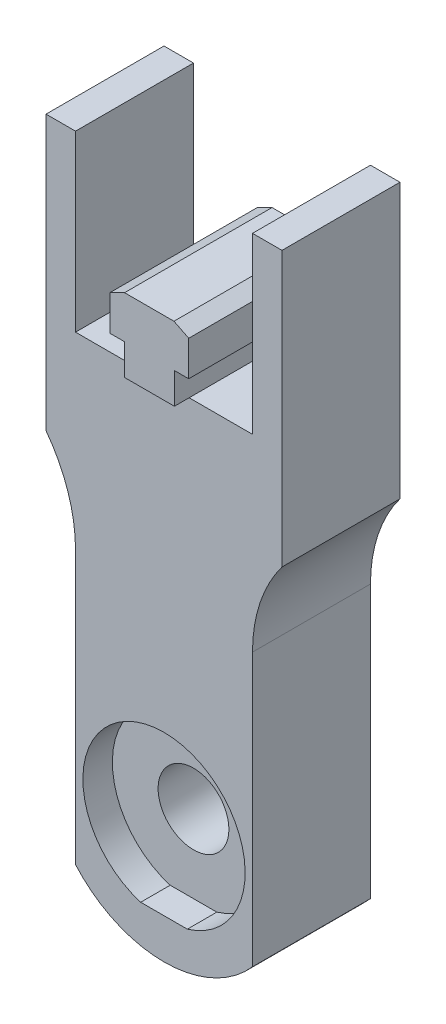
ISO-10303-21;
HEADER;
FILE_DESCRIPTION(('STEP AP214'),'2;1');
FILE_NAME('part.step','',(''),(''),'','','');
FILE_SCHEMA(('AUTOMOTIVE_DESIGN { 1 0 10303 214 1 1 1 1 }'));
ENDSEC;
DATA;
#1=APPLICATION_CONTEXT('core data for automotive mechanical design processes');
#2=APPLICATION_PROTOCOL_DEFINITION('international standard','automotive_design',2000,#1);
#3=PRODUCT_CONTEXT('',#1,'mechanical');
#4=PRODUCT('Part','Part','',(#3));
#5=PRODUCT_RELATED_PRODUCT_CATEGORY('part','',(#4));
#6=PRODUCT_DEFINITION_FORMATION('','',#4);
#7=PRODUCT_DEFINITION_CONTEXT('part definition',#1,'design');
#8=PRODUCT_DEFINITION('design','',#6,#7);
#9=PRODUCT_DEFINITION_SHAPE('','',#8);
#10=(LENGTH_UNIT() NAMED_UNIT(*) SI_UNIT(.MILLI.,.METRE.));
#11=(NAMED_UNIT(*) PLANE_ANGLE_UNIT() SI_UNIT($,.RADIAN.));
#12=(NAMED_UNIT(*) SI_UNIT($,.STERADIAN.) SOLID_ANGLE_UNIT());
#13=UNCERTAINTY_MEASURE_WITH_UNIT(LENGTH_MEASURE(1.E-05),#10,'distance_accuracy_value','');
#14=(GEOMETRIC_REPRESENTATION_CONTEXT(3) GLOBAL_UNCERTAINTY_ASSIGNED_CONTEXT((#13)) GLOBAL_UNIT_ASSIGNED_CONTEXT((#10,
#11,#12)) REPRESENTATION_CONTEXT('',''));
#15=CARTESIAN_POINT('',(0.,0.,0.));
#16=DIRECTION('',(0.,0.,1.));
#17=DIRECTION('',(1.,0.,0.));
#18=AXIS2_PLACEMENT_3D('',#15,#16,#17);
#19=CARTESIAN_POINT('',(5.98,-39.8802961275626,0.));
#20=DIRECTION('',(-1.,0.,0.));
#21=DIRECTION('',(0.,0.,1.));
#22=AXIS2_PLACEMENT_3D('',#19,#20,#21);
#23=PLANE('',#22);
#24=DIRECTION('',(0.,1.,0.));
#25=VECTOR('',#24,1.);
#26=CARTESIAN_POINT('',(5.98,-39.8802961275626,0.999999999999999));
#27=LINE('',#26,#25);
#28=CARTESIAN_POINT('',(5.98,-35.1482453199938,0.999999999999999));
#29=VERTEX_POINT('',#28);
#30=CARTESIAN_POINT('',(5.98,-16.6702961275626,0.999999999999999));
#31=VERTEX_POINT('',#30);
#32=EDGE_CURVE('E324',#29,#31,#27,.T.);
#33=ORIENTED_EDGE('',*,*,#32,.T.);
#34=DIRECTION('',(0.,0.,-1.));
#35=VECTOR('',#34,1.);
#36=CARTESIAN_POINT('',(5.98,-16.6702961275626,0.));
#37=LINE('',#36,#35);
#38=CARTESIAN_POINT('',(5.98,-16.6702961275626,9.));
#39=VERTEX_POINT('',#38);
#40=EDGE_CURVE('E63',#31,#39,#37,.F.);
#41=ORIENTED_EDGE('',*,*,#40,.T.);
#42=DIRECTION('',(0.,1.,0.));
#43=VECTOR('',#42,1.);
#44=CARTESIAN_POINT('',(5.98,-39.8802961275626,9.));
#45=LINE('',#44,#43);
#46=CARTESIAN_POINT('',(5.98,-35.1482453199938,9.));
#47=VERTEX_POINT('',#46);
#48=EDGE_CURVE('E233',#47,#39,#45,.T.);
#49=ORIENTED_EDGE('',*,*,#48,.F.);
#50=DIRECTION('',(0.,0.,-1.));
#51=VECTOR('',#50,1.);
#52=CARTESIAN_POINT('',(5.98,-35.1482453199938,0.));
#53=LINE('',#52,#51);
#54=EDGE_CURVE('E305',#47,#29,#53,.T.);
#55=ORIENTED_EDGE('',*,*,#54,.T.);
#56=EDGE_LOOP('',(#33,#41,#49,#55));
#57=FACE_BOUND('',#56,.T.);
#58=ADVANCED_FACE('F42',(#57),#23,.F.);
#59=CARTESIAN_POINT('',(0.,0.,9.));
#60=DIRECTION('',(0.,0.,1.));
#61=DIRECTION('',(1.,0.,0.));
#62=AXIS2_PLACEMENT_3D('',#59,#60,#61);
#63=PLANE('',#62);
#64=DIRECTION('',(1.,0.,0.));
#65=VECTOR('',#64,1.);
#66=CARTESIAN_POINT('',(0.,-35.1482453199938,9.));
#67=LINE('',#66,#65);
#68=CARTESIAN_POINT('',(-1.60073125671772,-35.1482453199938,9.));
#69=VERTEX_POINT('',#68);
#70=CARTESIAN_POINT('',(1.56073125671772,-35.1482453199938,9.));
#71=VERTEX_POINT('',#70);
#72=EDGE_CURVE('E284',#69,#71,#67,.T.);
#73=ORIENTED_EDGE('',*,*,#72,.F.);
#74=CARTESIAN_POINT('',(-0.0200000000000005,-29.8802961275626,9.));
#75=DIRECTION('',(0.,0.,1.));
#76=DIRECTION('',(1.,0.,0.));
#77=AXIS2_PLACEMENT_3D('',#74,#75,#76);
#78=CIRCLE('',#77,5.5);
#79=EDGE_CURVE('E326',#71,#69,#78,.T.);
#80=ORIENTED_EDGE('',*,*,#79,.F.);
#81=EDGE_LOOP('',(#73,#80));
#82=FACE_BOUND('',#81,.T.);
#83=DIRECTION('',(-1.,0.,0.));
#84=VECTOR('',#83,1.);
#85=CARTESIAN_POINT('',(1.685,-3.88029612756264,9.));
#86=LINE('',#85,#84);
#87=CARTESIAN_POINT('',(-1.715,-3.88029612756264,9.));
#88=VERTEX_POINT('',#87);
#89=CARTESIAN_POINT('',(-6.02,-3.88029612756264,9.));
#90=VERTEX_POINT('',#89);
#91=EDGE_CURVE('E329',#88,#90,#86,.T.);
#92=ORIENTED_EDGE('',*,*,#91,.T.);
#93=DIRECTION('',(0.,1.,0.));
#94=VECTOR('',#93,1.);
#95=CARTESIAN_POINT('',(-6.02,-10.6665976487904,9.));
#96=LINE('',#95,#94);
#97=CARTESIAN_POINT('',(-6.02,7.9237532834604,9.));
#98=VERTEX_POINT('',#97);
#99=EDGE_CURVE('E276',#90,#98,#96,.T.);
#100=ORIENTED_EDGE('',*,*,#99,.T.);
#101=DIRECTION('',(1.,0.,0.));
#102=VECTOR('',#101,1.);
#103=CARTESIAN_POINT('',(-8.02,7.9237532834604,9.));
#104=LINE('',#103,#102);
#105=CARTESIAN_POINT('',(-8.02,7.9237532834604,9.));
#106=VERTEX_POINT('',#105);
#107=EDGE_CURVE('E281',#106,#98,#104,.T.);
#108=ORIENTED_EDGE('',*,*,#107,.F.);
#109=DIRECTION('',(0.,1.,0.));
#110=VECTOR('',#109,1.);
#111=CARTESIAN_POINT('',(-8.02,-10.6665976487904,9.));
#112=LINE('',#111,#110);
#113=CARTESIAN_POINT('',(-8.02,-10.6665976487904,9.));
#114=VERTEX_POINT('',#113);
#115=EDGE_CURVE('E269',#114,#106,#112,.T.);
#116=ORIENTED_EDGE('',*,*,#115,.F.);
#117=CARTESIAN_POINT('',(-16.02,-16.6665976487904,9.));
#118=DIRECTION('',(0.,0.,1.));
#119=DIRECTION('',(1.,0.,0.));
#120=AXIS2_PLACEMENT_3D('',#117,#118,#119);
#121=CIRCLE('',#120,10.);
#122=CARTESIAN_POINT('',(-6.02,-16.6665976487904,9.));
#123=VERTEX_POINT('',#122);
#124=EDGE_CURVE('E434',#114,#123,#121,.F.);
#125=ORIENTED_EDGE('',*,*,#124,.T.);
#126=DIRECTION('',(0.,-1.,0.));
#127=VECTOR('',#126,1.);
#128=CARTESIAN_POINT('',(-6.02,-3.88029612756264,9.));
#129=LINE('',#128,#127);
#130=CARTESIAN_POINT('',(-6.02,-35.1482453199938,9.));
#131=VERTEX_POINT('',#130);
#132=EDGE_CURVE('E333',#123,#131,#129,.T.);
#133=ORIENTED_EDGE('',*,*,#132,.T.);
#134=CARTESIAN_POINT('',(-0.0200000000000005,-29.8802961275626,9.));
#135=DIRECTION('',(0.,0.,1.));
#136=DIRECTION('',(1.,0.,0.));
#137=AXIS2_PLACEMENT_3D('',#134,#135,#136);
#138=CIRCLE('',#137,7.98444041207871);
#139=EDGE_CURVE('E288',#131,#47,#138,.T.);
#140=ORIENTED_EDGE('',*,*,#139,.T.);
#141=ORIENTED_EDGE('',*,*,#48,.T.);
#142=CARTESIAN_POINT('',(15.98,-16.6702961275626,9.));
#143=DIRECTION('',(0.,0.,1.));
#144=DIRECTION('',(1.,0.,0.));
#145=AXIS2_PLACEMENT_3D('',#142,#143,#144);
#146=CIRCLE('',#145,10.);
#147=CARTESIAN_POINT('',(7.98,-10.6702961275626,9.));
#148=VERTEX_POINT('',#147);
#149=EDGE_CURVE('E11',#39,#148,#146,.F.);
#150=ORIENTED_EDGE('',*,*,#149,.T.);
#151=DIRECTION('',(0.,-1.,0.));
#152=VECTOR('',#151,1.);
#153=CARTESIAN_POINT('',(7.98,7.9237532834604,9.));
#154=LINE('',#153,#152);
#155=CARTESIAN_POINT('',(7.98,7.9237532834604,9.));
#156=VERTEX_POINT('',#155);
#157=EDGE_CURVE('E231',#156,#148,#154,.T.);
#158=ORIENTED_EDGE('',*,*,#157,.F.);
#159=DIRECTION('',(-1.,0.,0.));
#160=VECTOR('',#159,1.);
#161=CARTESIAN_POINT('',(7.98,7.9237532834604,9.));
#162=LINE('',#161,#160);
#163=CARTESIAN_POINT('',(5.98,7.9237532834604,9.));
#164=VERTEX_POINT('',#163);
#165=EDGE_CURVE('E250',#156,#164,#162,.T.);
#166=ORIENTED_EDGE('',*,*,#165,.T.);
#167=DIRECTION('',(0.,-1.,0.));
#168=VECTOR('',#167,1.);
#169=CARTESIAN_POINT('',(5.98,7.9237532834604,9.));
#170=LINE('',#169,#168);
#171=CARTESIAN_POINT('',(5.98,-3.88029612756264,9.));
#172=VERTEX_POINT('',#171);
#173=EDGE_CURVE('E251',#164,#172,#170,.T.);
#174=ORIENTED_EDGE('',*,*,#173,.T.);
#175=CARTESIAN_POINT('',(1.685,-3.88029612756264,9.));
#176=VERTEX_POINT('',#175);
#177=EDGE_CURVE('E330',#172,#176,#86,.T.);
#178=ORIENTED_EDGE('',*,*,#177,.T.);
#179=EDGE_CURVE('E334',#176,#88,#86,.T.);
#180=ORIENTED_EDGE('',*,*,#179,.T.);
#181=EDGE_LOOP('',(#92,#100,#108,#116,#125,#133,#140,#141,#150,#158,#166,#174,#178,#180));
#182=FACE_BOUND('',#181,.T.);
#183=ADVANCED_FACE('F229',(#82,#182),#63,.T.);
#184=CARTESIAN_POINT('',(-1.715,-3.88029612756264,10.));
#185=DIRECTION('',(0.,1.,0.));
#186=DIRECTION('',(0.,0.,1.));
#187=AXIS2_PLACEMENT_3D('',#184,#185,#186);
#188=PLANE('',#187);
#189=DIRECTION('',(-1.,0.,0.));
#190=VECTOR('',#189,1.);
#191=CARTESIAN_POINT('',(1.685,-3.88029612756264,0.999999999999999));
#192=LINE('',#191,#190);
#193=CARTESIAN_POINT('',(1.685,-3.88029612756264,0.999999999999999));
#194=VERTEX_POINT('',#193);
#195=CARTESIAN_POINT('',(-1.715,-3.88029612756264,0.999999999999999));
#196=VERTEX_POINT('',#195);
#197=EDGE_CURVE('E322',#194,#196,#192,.T.);
#198=ORIENTED_EDGE('',*,*,#197,.T.);
#199=DIRECTION('',(0.,0.,-1.));
#200=VECTOR('',#199,1.);
#201=CARTESIAN_POINT('',(-1.715,-3.88029612756264,10.));
#202=LINE('',#201,#200);
#203=CARTESIAN_POINT('',(-1.715,-3.88029612756264,0.));
#204=VERTEX_POINT('',#203);
#205=EDGE_CURVE('E417',#196,#204,#202,.T.);
#206=ORIENTED_EDGE('',*,*,#205,.T.);
#207=DIRECTION('',(1.,0.,0.));
#208=VECTOR('',#207,1.);
#209=CARTESIAN_POINT('',(-1.715,-3.88029612756264,0.));
#210=LINE('',#209,#208);
#211=CARTESIAN_POINT('',(1.685,-3.88029612756264,0.));
#212=VERTEX_POINT('',#211);
#213=EDGE_CURVE('E372',#204,#212,#210,.T.);
#214=ORIENTED_EDGE('',*,*,#213,.T.);
#215=DIRECTION('',(0.,0.,-1.));
#216=VECTOR('',#215,1.);
#217=CARTESIAN_POINT('',(1.685,-3.88029612756264,10.));
#218=LINE('',#217,#216);
#219=EDGE_CURVE('E413',#194,#212,#218,.T.);
#220=ORIENTED_EDGE('',*,*,#219,.F.);
#221=EDGE_LOOP('',(#198,#206,#214,#220));
#222=FACE_BOUND('',#221,.T.);
#223=ADVANCED_FACE('F464',(#222),#188,.F.);
#224=CARTESIAN_POINT('',(0.,-39.8802961275626,3.));
#225=DIRECTION('',(0.,0.,1.));
#226=DIRECTION('',(1.,0.,0.));
#227=AXIS2_PLACEMENT_3D('',#224,#225,#226);
#228=PLANE('',#227);
#229=CARTESIAN_POINT('',(-0.0200000000000005,-29.8802961275626,3.));
#230=DIRECTION('',(0.,0.,1.));
#231=DIRECTION('',(1.,0.,0.));
#232=AXIS2_PLACEMENT_3D('',#229,#230,#231);
#233=CIRCLE('',#232,2.4);
#234=CARTESIAN_POINT('',(2.38,-29.8802961275626,3.));
#235=VERTEX_POINT('',#234);
#236=EDGE_CURVE('E340',#235,#235,#233,.T.);
#237=ORIENTED_EDGE('',*,*,#236,.T.);
#238=EDGE_LOOP('',(#237));
#239=FACE_BOUND('',#238,.T.);
#240=CARTESIAN_POINT('',(-0.0200000000000005,-29.8802961275626,3.));
#241=DIRECTION('',(0.,0.,1.));
#242=DIRECTION('',(1.,0.,0.));
#243=AXIS2_PLACEMENT_3D('',#240,#241,#242);
#244=CIRCLE('',#243,5.5);
#245=CARTESIAN_POINT('',(1.56073125671772,-35.1482453199938,3.));
#246=VERTEX_POINT('',#245);
#247=CARTESIAN_POINT('',(-1.60073125671772,-35.1482453199938,3.));
#248=VERTEX_POINT('',#247);
#249=EDGE_CURVE('E428',#246,#248,#244,.T.);
#250=ORIENTED_EDGE('',*,*,#249,.F.);
#251=DIRECTION('',(-1.,0.,0.));
#252=VECTOR('',#251,1.);
#253=CARTESIAN_POINT('',(0.,-35.1482453199938,3.));
#254=LINE('',#253,#252);
#255=EDGE_CURVE('E308',#246,#248,#254,.T.);
#256=ORIENTED_EDGE('',*,*,#255,.T.);
#257=EDGE_LOOP('',(#250,#256));
#258=FACE_BOUND('',#257,.T.);
#259=ADVANCED_FACE('F471',(#239,#258),#228,.F.);
#260=CARTESIAN_POINT('',(0.,-39.8802961275626,7.));
#261=DIRECTION('',(0.,0.,1.));
#262=DIRECTION('',(1.,0.,0.));
#263=AXIS2_PLACEMENT_3D('',#260,#261,#262);
#264=PLANE('',#263);
#265=DIRECTION('',(-1.,0.,0.));
#266=VECTOR('',#265,1.);
#267=CARTESIAN_POINT('',(0.,-35.1482453199938,7.));
#268=LINE('',#267,#266);
#269=CARTESIAN_POINT('',(1.56073125671772,-35.1482453199938,7.));
#270=VERTEX_POINT('',#269);
#271=CARTESIAN_POINT('',(-1.60073125671772,-35.1482453199938,7.));
#272=VERTEX_POINT('',#271);
#273=EDGE_CURVE('E298',#270,#272,#268,.T.);
#274=ORIENTED_EDGE('',*,*,#273,.F.);
#275=CARTESIAN_POINT('',(-0.0200000000000005,-29.8802961275626,7.));
#276=DIRECTION('',(0.,0.,1.));
#277=DIRECTION('',(1.,0.,0.));
#278=AXIS2_PLACEMENT_3D('',#275,#276,#277);
#279=CIRCLE('',#278,5.5);
#280=EDGE_CURVE('E422',#272,#270,#279,.F.);
#281=ORIENTED_EDGE('',*,*,#280,.F.);
#282=EDGE_LOOP('',(#274,#281));
#283=FACE_BOUND('',#282,.T.);
#284=CARTESIAN_POINT('',(-0.0200000000000005,-29.8802961275626,7.));
#285=DIRECTION('',(0.,0.,1.));
#286=DIRECTION('',(1.,0.,0.));
#287=AXIS2_PLACEMENT_3D('',#284,#285,#286);
#288=CIRCLE('',#287,2.4);
#289=CARTESIAN_POINT('',(2.38,-29.8802961275626,7.));
#290=VERTEX_POINT('',#289);
#291=EDGE_CURVE('E337',#290,#290,#288,.T.);
#292=ORIENTED_EDGE('',*,*,#291,.F.);
#293=EDGE_LOOP('',(#292));
#294=FACE_BOUND('',#293,.T.);
#295=ADVANCED_FACE('F474',(#283,#294),#264,.T.);
#296=CARTESIAN_POINT('',(-1.715,-1.78029612756264,10.));
#297=DIRECTION('',(1.,0.,0.));
#298=DIRECTION('',(0.,1.,0.));
#299=AXIS2_PLACEMENT_3D('',#296,#297,#298);
#300=PLANE('',#299);
#301=DIRECTION('',(0.,-1.,0.));
#302=VECTOR('',#301,1.);
#303=CARTESIAN_POINT('',(-1.715,-1.78029612756264,0.));
#304=LINE('',#303,#302);
#305=CARTESIAN_POINT('',(-1.715,-1.78029612756264,0.));
#306=VERTEX_POINT('',#305);
#307=EDGE_CURVE('E346',#306,#204,#304,.T.);
#308=ORIENTED_EDGE('',*,*,#307,.T.);
#309=ORIENTED_EDGE('',*,*,#205,.F.);
#310=EDGE_CURVE('E423',#88,#196,#202,.T.);
#311=ORIENTED_EDGE('',*,*,#310,.F.);
#312=CARTESIAN_POINT('',(-1.715,-3.88029612756264,10.));
#313=VERTEX_POINT('',#312);
#314=EDGE_CURVE('E419',#313,#88,#202,.T.);
#315=ORIENTED_EDGE('',*,*,#314,.F.);
#316=DIRECTION('',(0.,-1.,0.));
#317=VECTOR('',#316,1.);
#318=CARTESIAN_POINT('',(-1.715,-1.78029612756264,10.));
#319=LINE('',#318,#317);
#320=CARTESIAN_POINT('',(-1.715,-1.78029612756264,10.));
#321=VERTEX_POINT('',#320);
#322=EDGE_CURVE('E347',#321,#313,#319,.T.);
#323=ORIENTED_EDGE('',*,*,#322,.F.);
#324=DIRECTION('',(0.,0.,-1.));
#325=VECTOR('',#324,1.);
#326=CARTESIAN_POINT('',(-1.715,-1.78029612756264,10.));
#327=LINE('',#326,#325);
#328=EDGE_CURVE('E369',#321,#306,#327,.T.);
#329=ORIENTED_EDGE('',*,*,#328,.T.);
#330=EDGE_LOOP('',(#308,#309,#311,#315,#323,#329));
#331=FACE_BOUND('',#330,.T.);
#332=ADVANCED_FACE('F481',(#331),#300,.F.);
#333=ORIENTED_EDGE('',*,*,#314,.T.);
#334=ORIENTED_EDGE('',*,*,#179,.F.);
#335=CARTESIAN_POINT('',(1.685,-3.88029612756264,10.));
#336=VERTEX_POINT('',#335);
#337=EDGE_CURVE('E414',#336,#176,#218,.T.);
#338=ORIENTED_EDGE('',*,*,#337,.F.);
#339=DIRECTION('',(1.,0.,0.));
#340=VECTOR('',#339,1.);
#341=CARTESIAN_POINT('',(-1.715,-3.88029612756264,10.));
#342=LINE('',#341,#340);
#343=EDGE_CURVE('E350',#313,#336,#342,.T.);
#344=ORIENTED_EDGE('',*,*,#343,.F.);
#345=EDGE_LOOP('',(#333,#334,#338,#344));
#346=FACE_BOUND('',#345,.T.);
#347=ADVANCED_FACE('F522',(#346),#188,.F.);
#348=CARTESIAN_POINT('',(1.685,-1.78029612756264,10.));
#349=DIRECTION('',(-1.,0.,0.));
#350=DIRECTION('',(0.,-1.,0.));
#351=AXIS2_PLACEMENT_3D('',#348,#349,#350);
#352=PLANE('',#351);
#353=DIRECTION('',(0.,1.,0.));
#354=VECTOR('',#353,1.);
#355=CARTESIAN_POINT('',(1.685,-1.78029612756264,0.));
#356=LINE('',#355,#354);
#357=CARTESIAN_POINT('',(1.685,-1.78029612756264,0.));
#358=VERTEX_POINT('',#357);
#359=EDGE_CURVE('E375',#212,#358,#356,.T.);
#360=ORIENTED_EDGE('',*,*,#359,.T.);
#361=DIRECTION('',(0.,0.,-1.));
#362=VECTOR('',#361,1.);
#363=CARTESIAN_POINT('',(1.685,-1.78029612756264,10.));
#364=LINE('',#363,#362);
#365=CARTESIAN_POINT('',(1.685,-1.78029612756264,10.));
#366=VERTEX_POINT('',#365);
#367=EDGE_CURVE('E410',#366,#358,#364,.T.);
#368=ORIENTED_EDGE('',*,*,#367,.F.);
#369=DIRECTION('',(0.,1.,0.));
#370=VECTOR('',#369,1.);
#371=CARTESIAN_POINT('',(1.685,-1.78029612756264,10.));
#372=LINE('',#371,#370);
#373=EDGE_CURVE('E353',#336,#366,#372,.T.);
#374=ORIENTED_EDGE('',*,*,#373,.F.);
#375=ORIENTED_EDGE('',*,*,#337,.T.);
#376=EDGE_CURVE('E418',#176,#194,#218,.T.);
#377=ORIENTED_EDGE('',*,*,#376,.T.);
#378=ORIENTED_EDGE('',*,*,#219,.T.);
#379=EDGE_LOOP('',(#360,#368,#374,#375,#377,#378));
#380=FACE_BOUND('',#379,.T.);
#381=ADVANCED_FACE('F518',(#380),#352,.F.);
#382=CARTESIAN_POINT('',(1.685,-1.78029612756264,10.));
#383=DIRECTION('',(0.,1.,0.));
#384=DIRECTION('',(0.,0.,1.));
#385=AXIS2_PLACEMENT_3D('',#382,#383,#384);
#386=PLANE('',#385);
#387=DIRECTION('',(1.,0.,0.));
#388=VECTOR('',#387,1.);
#389=CARTESIAN_POINT('',(1.685,-1.78029612756264,0.));
#390=LINE('',#389,#388);
#391=CARTESIAN_POINT('',(2.655,-1.78029612756264,0.));
#392=VERTEX_POINT('',#391);
#393=EDGE_CURVE('E377',#358,#392,#390,.T.);
#394=ORIENTED_EDGE('',*,*,#393,.T.);
#395=DIRECTION('',(0.,0.,-1.));
#396=VECTOR('',#395,1.);
#397=CARTESIAN_POINT('',(2.655,-1.78029612756264,10.));
#398=LINE('',#397,#396);
#399=CARTESIAN_POINT('',(2.655,-1.78029612756264,10.));
#400=VERTEX_POINT('',#399);
#401=EDGE_CURVE('E407',#400,#392,#398,.T.);
#402=ORIENTED_EDGE('',*,*,#401,.F.);
#403=DIRECTION('',(1.,0.,0.));
#404=VECTOR('',#403,1.);
#405=CARTESIAN_POINT('',(1.685,-1.78029612756264,10.));
#406=LINE('',#405,#404);
#407=EDGE_CURVE('E355',#366,#400,#406,.T.);
#408=ORIENTED_EDGE('',*,*,#407,.F.);
#409=ORIENTED_EDGE('',*,*,#367,.T.);
#410=EDGE_LOOP('',(#394,#402,#408,#409));
#411=FACE_BOUND('',#410,.T.);
#412=ADVANCED_FACE('F514',(#411),#386,.F.);
#413=CARTESIAN_POINT('',(2.655,-1.78029612756264,10.));
#414=DIRECTION('',(-1.,0.,0.));
#415=DIRECTION('',(0.,-1.,0.));
#416=AXIS2_PLACEMENT_3D('',#413,#414,#415);
#417=PLANE('',#416);
#418=DIRECTION('',(0.,1.,0.));
#419=VECTOR('',#418,1.);
#420=CARTESIAN_POINT('',(2.655,-1.78029612756264,0.));
#421=LINE('',#420,#419);
#422=CARTESIAN_POINT('',(2.655,0.599703872437357,0.));
#423=VERTEX_POINT('',#422);
#424=EDGE_CURVE('E379',#392,#423,#421,.T.);
#425=ORIENTED_EDGE('',*,*,#424,.T.);
#426=DIRECTION('',(0.,0.,-1.));
#427=VECTOR('',#426,1.);
#428=CARTESIAN_POINT('',(2.655,0.599703872437357,10.));
#429=LINE('',#428,#427);
#430=CARTESIAN_POINT('',(2.655,0.599703872437357,10.));
#431=VERTEX_POINT('',#430);
#432=EDGE_CURVE('E404',#431,#423,#429,.T.);
#433=ORIENTED_EDGE('',*,*,#432,.F.);
#434=DIRECTION('',(0.,1.,0.));
#435=VECTOR('',#434,1.);
#436=CARTESIAN_POINT('',(2.655,-1.78029612756264,10.));
#437=LINE('',#436,#435);
#438=EDGE_CURVE('E357',#400,#431,#437,.T.);
#439=ORIENTED_EDGE('',*,*,#438,.F.);
#440=ORIENTED_EDGE('',*,*,#401,.T.);
#441=EDGE_LOOP('',(#425,#433,#439,#440));
#442=FACE_BOUND('',#441,.T.);
#443=ADVANCED_FACE('F510',(#442),#417,.F.);
#444=CARTESIAN_POINT('',(2.655,0.599703872437357,10.));
#445=DIRECTION('',(-0.447213595499958,-0.894427190999916,0.));
#446=DIRECTION('',(0.894427190999916,-0.447213595499958,0.));
#447=AXIS2_PLACEMENT_3D('',#444,#445,#446);
#448=PLANE('',#447);
#449=DIRECTION('',(-0.894427190999916,0.447213595499958,0.));
#450=VECTOR('',#449,1.);
#451=CARTESIAN_POINT('',(2.655,0.599703872437357,0.));
#452=LINE('',#451,#450);
#453=CARTESIAN_POINT('',(1.655,1.09970387243736,0.));
#454=VERTEX_POINT('',#453);
#455=EDGE_CURVE('E381',#423,#454,#452,.T.);
#456=ORIENTED_EDGE('',*,*,#455,.T.);
#457=DIRECTION('',(0.,0.,-1.));
#458=VECTOR('',#457,1.);
#459=CARTESIAN_POINT('',(1.655,1.09970387243736,10.));
#460=LINE('',#459,#458);
#461=CARTESIAN_POINT('',(1.655,1.09970387243736,10.));
#462=VERTEX_POINT('',#461);
#463=EDGE_CURVE('E401',#462,#454,#460,.T.);
#464=ORIENTED_EDGE('',*,*,#463,.F.);
#465=DIRECTION('',(-0.894427190999916,0.447213595499958,0.));
#466=VECTOR('',#465,1.);
#467=CARTESIAN_POINT('',(2.655,0.599703872437357,10.));
#468=LINE('',#467,#466);
#469=EDGE_CURVE('E359',#431,#462,#468,.T.);
#470=ORIENTED_EDGE('',*,*,#469,.F.);
#471=ORIENTED_EDGE('',*,*,#432,.T.);
#472=EDGE_LOOP('',(#456,#464,#470,#471));
#473=FACE_BOUND('',#472,.T.);
#474=ADVANCED_FACE('F506',(#473),#448,.F.);
#475=CARTESIAN_POINT('',(-1.695,1.09970387243736,10.));
#476=DIRECTION('',(0.,-1.,0.));
#477=DIRECTION('',(0.,0.,-1.));
#478=AXIS2_PLACEMENT_3D('',#475,#476,#477);
#479=PLANE('',#478);
#480=DIRECTION('',(-1.,0.,0.));
#481=VECTOR('',#480,1.);
#482=CARTESIAN_POINT('',(-1.695,1.09970387243736,0.));
#483=LINE('',#482,#481);
#484=CARTESIAN_POINT('',(-1.695,1.09970387243736,0.));
#485=VERTEX_POINT('',#484);
#486=EDGE_CURVE('E383',#454,#485,#483,.T.);
#487=ORIENTED_EDGE('',*,*,#486,.T.);
#488=DIRECTION('',(0.,0.,-1.));
#489=VECTOR('',#488,1.);
#490=CARTESIAN_POINT('',(-1.695,1.09970387243736,10.));
#491=LINE('',#490,#489);
#492=CARTESIAN_POINT('',(-1.695,1.09970387243736,10.));
#493=VERTEX_POINT('',#492);
#494=EDGE_CURVE('E398',#493,#485,#491,.T.);
#495=ORIENTED_EDGE('',*,*,#494,.F.);
#496=DIRECTION('',(-1.,0.,0.));
#497=VECTOR('',#496,1.);
#498=CARTESIAN_POINT('',(-1.695,1.09970387243736,10.));
#499=LINE('',#498,#497);
#500=EDGE_CURVE('E361',#462,#493,#499,.T.);
#501=ORIENTED_EDGE('',*,*,#500,.F.);
#502=ORIENTED_EDGE('',*,*,#463,.T.);
#503=EDGE_LOOP('',(#487,#495,#501,#502));
#504=FACE_BOUND('',#503,.T.);
#505=ADVANCED_FACE('F502',(#504),#479,.F.);
#506=CARTESIAN_POINT('',(-2.695,0.599703872437357,10.));
#507=DIRECTION('',(0.447213595499958,-0.894427190999916,0.));
#508=DIRECTION('',(0.894427190999916,0.447213595499958,0.));
#509=AXIS2_PLACEMENT_3D('',#506,#507,#508);
#510=PLANE('',#509);
#511=DIRECTION('',(-0.894427190999916,-0.447213595499958,0.));
#512=VECTOR('',#511,1.);
#513=CARTESIAN_POINT('',(-2.695,0.599703872437357,0.));
#514=LINE('',#513,#512);
#515=CARTESIAN_POINT('',(-2.695,0.599703872437357,0.));
#516=VERTEX_POINT('',#515);
#517=EDGE_CURVE('E385',#485,#516,#514,.T.);
#518=ORIENTED_EDGE('',*,*,#517,.T.);
#519=DIRECTION('',(0.,0.,-1.));
#520=VECTOR('',#519,1.);
#521=CARTESIAN_POINT('',(-2.695,0.599703872437357,10.));
#522=LINE('',#521,#520);
#523=CARTESIAN_POINT('',(-2.695,0.599703872437357,10.));
#524=VERTEX_POINT('',#523);
#525=EDGE_CURVE('E395',#524,#516,#522,.T.);
#526=ORIENTED_EDGE('',*,*,#525,.F.);
#527=DIRECTION('',(-0.894427190999916,-0.447213595499958,0.));
#528=VECTOR('',#527,1.);
#529=CARTESIAN_POINT('',(-2.695,0.599703872437357,10.));
#530=LINE('',#529,#528);
#531=EDGE_CURVE('E363',#493,#524,#530,.T.);
#532=ORIENTED_EDGE('',*,*,#531,.F.);
#533=ORIENTED_EDGE('',*,*,#494,.T.);
#534=EDGE_LOOP('',(#518,#526,#532,#533));
#535=FACE_BOUND('',#534,.T.);
#536=ADVANCED_FACE('F498',(#535),#510,.F.);
#537=CARTESIAN_POINT('',(-2.695,-1.78029612756264,10.));
#538=DIRECTION('',(1.,0.,0.));
#539=DIRECTION('',(0.,0.,-1.));
#540=AXIS2_PLACEMENT_3D('',#537,#538,#539);
#541=PLANE('',#540);
#542=DIRECTION('',(0.,-1.,0.));
#543=VECTOR('',#542,1.);
#544=CARTESIAN_POINT('',(-2.695,-1.78029612756264,0.));
#545=LINE('',#544,#543);
#546=CARTESIAN_POINT('',(-2.695,-1.78029612756264,0.));
#547=VERTEX_POINT('',#546);
#548=EDGE_CURVE('E387',#516,#547,#545,.T.);
#549=ORIENTED_EDGE('',*,*,#548,.T.);
#550=DIRECTION('',(0.,0.,-1.));
#551=VECTOR('',#550,1.);
#552=CARTESIAN_POINT('',(-2.695,-1.78029612756264,10.));
#553=LINE('',#552,#551);
#554=CARTESIAN_POINT('',(-2.695,-1.78029612756264,10.));
#555=VERTEX_POINT('',#554);
#556=EDGE_CURVE('E392',#555,#547,#553,.T.);
#557=ORIENTED_EDGE('',*,*,#556,.F.);
#558=DIRECTION('',(0.,-1.,0.));
#559=VECTOR('',#558,1.);
#560=CARTESIAN_POINT('',(-2.695,-1.78029612756264,10.));
#561=LINE('',#560,#559);
#562=EDGE_CURVE('E365',#524,#555,#561,.T.);
#563=ORIENTED_EDGE('',*,*,#562,.F.);
#564=ORIENTED_EDGE('',*,*,#525,.T.);
#565=EDGE_LOOP('',(#549,#557,#563,#564));
#566=FACE_BOUND('',#565,.T.);
#567=ADVANCED_FACE('F494',(#566),#541,.F.);
#568=CARTESIAN_POINT('',(-2.695,-1.78029612756264,10.));
#569=DIRECTION('',(0.,1.,0.));
#570=DIRECTION('',(-1.,0.,0.));
#571=AXIS2_PLACEMENT_3D('',#568,#569,#570);
#572=PLANE('',#571);
#573=DIRECTION('',(1.,0.,0.));
#574=VECTOR('',#573,1.);
#575=CARTESIAN_POINT('',(-2.695,-1.78029612756264,0.));
#576=LINE('',#575,#574);
#577=EDGE_CURVE('E351',#547,#306,#576,.T.);
#578=ORIENTED_EDGE('',*,*,#577,.T.);
#579=ORIENTED_EDGE('',*,*,#328,.F.);
#580=DIRECTION('',(1.,0.,0.));
#581=VECTOR('',#580,1.);
#582=CARTESIAN_POINT('',(-2.695,-1.78029612756264,10.));
#583=LINE('',#582,#581);
#584=EDGE_CURVE('E367',#555,#321,#583,.T.);
#585=ORIENTED_EDGE('',*,*,#584,.F.);
#586=ORIENTED_EDGE('',*,*,#556,.T.);
#587=EDGE_LOOP('',(#578,#579,#585,#586));
#588=FACE_BOUND('',#587,.T.);
#589=ADVANCED_FACE('F487',(#588),#572,.F.);
#590=CARTESIAN_POINT('',(0.,0.,10.));
#591=DIRECTION('',(0.,0.,1.));
#592=DIRECTION('',(1.,0.,0.));
#593=AXIS2_PLACEMENT_3D('',#590,#591,#592);
#594=PLANE('',#593);
#595=ORIENTED_EDGE('',*,*,#322,.T.);
#596=ORIENTED_EDGE('',*,*,#343,.T.);
#597=ORIENTED_EDGE('',*,*,#373,.T.);
#598=ORIENTED_EDGE('',*,*,#407,.T.);
#599=ORIENTED_EDGE('',*,*,#438,.T.);
#600=ORIENTED_EDGE('',*,*,#469,.T.);
#601=ORIENTED_EDGE('',*,*,#500,.T.);
#602=ORIENTED_EDGE('',*,*,#531,.T.);
#603=ORIENTED_EDGE('',*,*,#562,.T.);
#604=ORIENTED_EDGE('',*,*,#584,.T.);
#605=EDGE_LOOP('',(#595,#596,#597,#598,#599,#600,#601,#602,#603,#604));
#606=FACE_BOUND('',#605,.T.);
#607=ADVANCED_FACE('F483',(#606),#594,.T.);
#608=CARTESIAN_POINT('',(0.,0.,0.));
#609=DIRECTION('',(0.,0.,1.));
#610=DIRECTION('',(1.,0.,0.));
#611=AXIS2_PLACEMENT_3D('',#608,#609,#610);
#612=PLANE('',#611);
#613=ORIENTED_EDGE('',*,*,#307,.F.);
#614=ORIENTED_EDGE('',*,*,#577,.F.);
#615=ORIENTED_EDGE('',*,*,#548,.F.);
#616=ORIENTED_EDGE('',*,*,#517,.F.);
#617=ORIENTED_EDGE('',*,*,#486,.F.);
#618=ORIENTED_EDGE('',*,*,#455,.F.);
#619=ORIENTED_EDGE('',*,*,#424,.F.);
#620=ORIENTED_EDGE('',*,*,#393,.F.);
#621=ORIENTED_EDGE('',*,*,#359,.F.);
#622=ORIENTED_EDGE('',*,*,#213,.F.);
#623=EDGE_LOOP('',(#613,#614,#615,#616,#617,#618,#619,#620,#621,#622));
#624=FACE_BOUND('',#623,.T.);
#625=ADVANCED_FACE('F486',(#624),#612,.F.);
#626=CARTESIAN_POINT('',(0.,-3.88029612756264,0.));
#627=DIRECTION('',(0.,-1.,0.));
#628=DIRECTION('',(0.,0.,-1.));
#629=AXIS2_PLACEMENT_3D('',#626,#627,#628);
#630=PLANE('',#629);
#631=ORIENTED_EDGE('',*,*,#310,.T.);
#632=CARTESIAN_POINT('',(-6.02,-3.88029612756264,0.999999999999999));
#633=VERTEX_POINT('',#632);
#634=EDGE_CURVE('E317',#196,#633,#192,.T.);
#635=ORIENTED_EDGE('',*,*,#634,.T.);
#636=DIRECTION('',(0.,0.,1.));
#637=VECTOR('',#636,1.);
#638=CARTESIAN_POINT('',(-6.02,-3.88029612756264,0.));
#639=LINE('',#638,#637);
#640=EDGE_CURVE('E341',#633,#90,#639,.T.);
#641=ORIENTED_EDGE('',*,*,#640,.T.);
#642=ORIENTED_EDGE('',*,*,#91,.F.);
#643=EDGE_LOOP('',(#631,#635,#641,#642));
#644=FACE_BOUND('',#643,.T.);
#645=ADVANCED_FACE('F478',(#644),#630,.F.);
#646=CARTESIAN_POINT('',(-6.02,-39.8802961275626,0.));
#647=DIRECTION('',(-1.,0.,0.));
#648=DIRECTION('',(0.,0.,1.));
#649=AXIS2_PLACEMENT_3D('',#646,#647,#648);
#650=PLANE('',#649);
#651=ORIENTED_EDGE('',*,*,#132,.F.);
#652=DIRECTION('',(0.,0.,1.));
#653=VECTOR('',#652,1.);
#654=CARTESIAN_POINT('',(-6.02,-16.6665976487904,0.999999999999999));
#655=LINE('',#654,#653);
#656=CARTESIAN_POINT('',(-6.02,-16.6665976487904,0.999999999999999));
#657=VERTEX_POINT('',#656);
#658=EDGE_CURVE('E431',#123,#657,#655,.F.);
#659=ORIENTED_EDGE('',*,*,#658,.T.);
#660=DIRECTION('',(0.,-1.,0.));
#661=VECTOR('',#660,1.);
#662=CARTESIAN_POINT('',(-6.02,-3.88029612756264,0.999999999999999));
#663=LINE('',#662,#661);
#664=CARTESIAN_POINT('',(-6.02,-35.1482453199938,0.999999999999999));
#665=VERTEX_POINT('',#664);
#666=EDGE_CURVE('E321',#657,#665,#663,.T.);
#667=ORIENTED_EDGE('',*,*,#666,.T.);
#668=DIRECTION('',(0.,0.,-1.));
#669=VECTOR('',#668,1.);
#670=CARTESIAN_POINT('',(-6.02,-35.1482453199938,0.));
#671=LINE('',#670,#669);
#672=EDGE_CURVE('E295',#131,#665,#671,.T.);
#673=ORIENTED_EDGE('',*,*,#672,.F.);
#674=EDGE_LOOP('',(#651,#659,#667,#673));
#675=FACE_BOUND('',#674,.T.);
#676=ADVANCED_FACE('F456',(#675),#650,.T.);
#677=ORIENTED_EDGE('',*,*,#177,.F.);
#678=DIRECTION('',(0.,0.,1.));
#679=VECTOR('',#678,1.);
#680=CARTESIAN_POINT('',(5.98,-3.88029612756264,0.));
#681=LINE('',#680,#679);
#682=CARTESIAN_POINT('',(5.98,-3.88029612756264,0.999999999999999));
#683=VERTEX_POINT('',#682);
#684=EDGE_CURVE('E343',#683,#172,#681,.T.);
#685=ORIENTED_EDGE('',*,*,#684,.F.);
#686=EDGE_CURVE('E318',#683,#194,#192,.T.);
#687=ORIENTED_EDGE('',*,*,#686,.T.);
#688=ORIENTED_EDGE('',*,*,#376,.F.);
#689=EDGE_LOOP('',(#677,#685,#687,#688));
#690=FACE_BOUND('',#689,.T.);
#691=ADVANCED_FACE('F469',(#690),#630,.F.);
#692=CARTESIAN_POINT('',(-0.0200000000000005,-29.8802961275626,-1.));
#693=DIRECTION('',(0.,0.,1.));
#694=DIRECTION('',(1.,0.,0.));
#695=AXIS2_PLACEMENT_3D('',#692,#693,#694);
#696=CYLINDRICAL_SURFACE('',#695,2.4);
#697=ORIENTED_EDGE('',*,*,#291,.T.);
#698=EDGE_LOOP('',(#697));
#699=FACE_BOUND('',#698,.T.);
#700=ORIENTED_EDGE('',*,*,#236,.F.);
#701=EDGE_LOOP('',(#700));
#702=FACE_BOUND('',#701,.T.);
#703=ADVANCED_FACE('F571',(#699,#702),#696,.F.);
#704=CARTESIAN_POINT('',(-0.0200000000000005,-29.8802961275626,9.));
#705=DIRECTION('',(0.,0.,-1.));
#706=DIRECTION('',(-1.,0.,0.));
#707=AXIS2_PLACEMENT_3D('',#704,#705,#706);
#708=CYLINDRICAL_SURFACE('',#707,5.5);
#709=DIRECTION('',(0.,0.,-1.));
#710=VECTOR('',#709,1.);
#711=CARTESIAN_POINT('',(1.56073125671772,-35.1482453199938,9.));
#712=LINE('',#711,#710);
#713=EDGE_CURVE('E300',#71,#270,#712,.T.);
#714=ORIENTED_EDGE('',*,*,#713,.F.);
#715=ORIENTED_EDGE('',*,*,#79,.T.);
#716=DIRECTION('',(0.,0.,-1.));
#717=VECTOR('',#716,1.);
#718=CARTESIAN_POINT('',(-1.60073125671772,-35.1482453199938,9.));
#719=LINE('',#718,#717);
#720=EDGE_CURVE('E293',#272,#69,#719,.F.);
#721=ORIENTED_EDGE('',*,*,#720,.F.);
#722=ORIENTED_EDGE('',*,*,#280,.T.);
#723=EDGE_LOOP('',(#714,#715,#721,#722));
#724=FACE_BOUND('',#723,.T.);
#725=ADVANCED_FACE('F566',(#724),#708,.F.);
#726=CARTESIAN_POINT('',(-0.0200000000000005,-29.8802961275626,0.999999999999999));
#727=DIRECTION('',(0.,0.,1.));
#728=DIRECTION('',(1.,0.,0.));
#729=AXIS2_PLACEMENT_3D('',#726,#727,#728);
#730=CYLINDRICAL_SURFACE('',#729,5.5);
#731=ORIENTED_EDGE('',*,*,#249,.T.);
#732=DIRECTION('',(0.,0.,1.));
#733=VECTOR('',#732,1.);
#734=CARTESIAN_POINT('',(-1.60073125671772,-35.1482453199938,0.999999999999999));
#735=LINE('',#734,#733);
#736=CARTESIAN_POINT('',(-1.60073125671772,-35.1482453199938,0.999999999999999));
#737=VERTEX_POINT('',#736);
#738=EDGE_CURVE('E311',#248,#737,#735,.F.);
#739=ORIENTED_EDGE('',*,*,#738,.T.);
#740=CARTESIAN_POINT('',(-0.0200000000000005,-29.8802961275626,0.999999999999999));
#741=DIRECTION('',(0.,0.,1.));
#742=DIRECTION('',(1.,0.,0.));
#743=AXIS2_PLACEMENT_3D('',#740,#741,#742);
#744=CIRCLE('',#743,5.5);
#745=CARTESIAN_POINT('',(1.56073125671772,-35.1482453199938,0.999999999999999));
#746=VERTEX_POINT('',#745);
#747=EDGE_CURVE('E314',#746,#737,#744,.T.);
#748=ORIENTED_EDGE('',*,*,#747,.F.);
#749=DIRECTION('',(0.,0.,1.));
#750=VECTOR('',#749,1.);
#751=CARTESIAN_POINT('',(1.56073125671772,-35.1482453199938,0.999999999999999));
#752=LINE('',#751,#750);
#753=EDGE_CURVE('E302',#746,#246,#752,.T.);
#754=ORIENTED_EDGE('',*,*,#753,.T.);
#755=EDGE_LOOP('',(#731,#739,#748,#754));
#756=FACE_BOUND('',#755,.T.);
#757=ADVANCED_FACE('F563',(#756),#730,.F.);
#758=CARTESIAN_POINT('',(0.,0.,0.999999999999999));
#759=DIRECTION('',(0.,0.,1.));
#760=DIRECTION('',(1.,0.,0.));
#761=AXIS2_PLACEMENT_3D('',#758,#759,#760);
#762=PLANE('',#761);
#763=CARTESIAN_POINT('',(-0.0200000000000005,-29.8802961275626,0.999999999999999));
#764=DIRECTION('',(0.,0.,1.));
#765=DIRECTION('',(1.,0.,0.));
#766=AXIS2_PLACEMENT_3D('',#763,#764,#765);
#767=CIRCLE('',#766,7.98444041207871);
#768=EDGE_CURVE('E287',#29,#665,#767,.F.);
#769=ORIENTED_EDGE('',*,*,#768,.T.);
#770=ORIENTED_EDGE('',*,*,#666,.F.);
#771=CARTESIAN_POINT('',(-16.02,-16.6665976487904,0.999999999999999));
#772=DIRECTION('',(0.,0.,1.));
#773=DIRECTION('',(1.,0.,0.));
#774=AXIS2_PLACEMENT_3D('',#771,#772,#773);
#775=CIRCLE('',#774,10.);
#776=CARTESIAN_POINT('',(-8.02,-10.6665976487904,0.999999999999999));
#777=VERTEX_POINT('',#776);
#778=EDGE_CURVE('E436',#657,#777,#775,.T.);
#779=ORIENTED_EDGE('',*,*,#778,.T.);
#780=DIRECTION('',(0.,-1.,0.));
#781=VECTOR('',#780,1.);
#782=CARTESIAN_POINT('',(-8.02,-10.6665976487904,0.999999999999999));
#783=LINE('',#782,#781);
#784=CARTESIAN_POINT('',(-8.02,7.9237532834604,0.999999999999999));
#785=VERTEX_POINT('',#784);
#786=EDGE_CURVE('E262',#785,#777,#783,.T.);
#787=ORIENTED_EDGE('',*,*,#786,.F.);
#788=DIRECTION('',(1.,0.,0.));
#789=VECTOR('',#788,1.);
#790=CARTESIAN_POINT('',(-8.02,7.9237532834604,0.999999999999999));
#791=LINE('',#790,#789);
#792=CARTESIAN_POINT('',(-6.02,7.9237532834604,0.999999999999999));
#793=VERTEX_POINT('',#792);
#794=EDGE_CURVE('E273',#785,#793,#791,.T.);
#795=ORIENTED_EDGE('',*,*,#794,.T.);
#796=DIRECTION('',(0.,-1.,0.));
#797=VECTOR('',#796,1.);
#798=CARTESIAN_POINT('',(-6.02,-10.6665976487904,0.999999999999999));
#799=LINE('',#798,#797);
#800=EDGE_CURVE('E261',#793,#633,#799,.T.);
#801=ORIENTED_EDGE('',*,*,#800,.T.);
#802=ORIENTED_EDGE('',*,*,#634,.F.);
#803=ORIENTED_EDGE('',*,*,#197,.F.);
#804=ORIENTED_EDGE('',*,*,#686,.F.);
#805=DIRECTION('',(0.,1.,0.));
#806=VECTOR('',#805,1.);
#807=CARTESIAN_POINT('',(5.98,7.9237532834604,0.999999999999999));
#808=LINE('',#807,#806);
#809=CARTESIAN_POINT('',(5.98,7.9237532834604,0.999999999999999));
#810=VERTEX_POINT('',#809);
#811=EDGE_CURVE('E254',#683,#810,#808,.T.);
#812=ORIENTED_EDGE('',*,*,#811,.T.);
#813=DIRECTION('',(-1.,0.,0.));
#814=VECTOR('',#813,1.);
#815=CARTESIAN_POINT('',(7.98,7.9237532834604,0.999999999999999));
#816=LINE('',#815,#814);
#817=CARTESIAN_POINT('',(7.98,7.9237532834604,0.999999999999999));
#818=VERTEX_POINT('',#817);
#819=EDGE_CURVE('E258',#818,#810,#816,.T.);
#820=ORIENTED_EDGE('',*,*,#819,.F.);
#821=DIRECTION('',(0.,1.,0.));
#822=VECTOR('',#821,1.);
#823=CARTESIAN_POINT('',(7.98,7.9237532834604,0.999999999999999));
#824=LINE('',#823,#822);
#825=CARTESIAN_POINT('',(7.98,-10.6702961275626,0.999999999999999));
#826=VERTEX_POINT('',#825);
#827=EDGE_CURVE('E245',#826,#818,#824,.T.);
#828=ORIENTED_EDGE('',*,*,#827,.F.);
#829=CARTESIAN_POINT('',(15.98,-16.6702961275626,0.999999999999999));
#830=DIRECTION('',(0.,0.,1.));
#831=DIRECTION('',(1.,0.,0.));
#832=AXIS2_PLACEMENT_3D('',#829,#830,#831);
#833=CIRCLE('',#832,10.);
#834=EDGE_CURVE('E50',#826,#31,#833,.T.);
#835=ORIENTED_EDGE('',*,*,#834,.T.);
#836=ORIENTED_EDGE('',*,*,#32,.F.);
#837=EDGE_LOOP('',(#769,#770,#779,#787,#795,#801,#802,#803,#804,#812,#820,#828,#835,#836));
#838=FACE_BOUND('',#837,.T.);
#839=ORIENTED_EDGE('',*,*,#747,.T.);
#840=DIRECTION('',(-1.,0.,0.));
#841=VECTOR('',#840,1.);
#842=CARTESIAN_POINT('',(0.,-35.1482453199938,0.999999999999999));
#843=LINE('',#842,#841);
#844=EDGE_CURVE('E285',#746,#737,#843,.T.);
#845=ORIENTED_EDGE('',*,*,#844,.F.);
#846=EDGE_LOOP('',(#839,#845));
#847=FACE_BOUND('',#846,.T.);
#848=ADVANCED_FACE('F440',(#838,#847),#762,.F.);
#849=CARTESIAN_POINT('',(0.,-35.1482453199938,-11.3036305433162));
#850=DIRECTION('',(0.,-1.,0.));
#851=DIRECTION('',(0.,0.,-1.));
#852=AXIS2_PLACEMENT_3D('',#849,#850,#851);
#853=PLANE('',#852);
#854=ORIENTED_EDGE('',*,*,#255,.F.);
#855=ORIENTED_EDGE('',*,*,#753,.F.);
#856=ORIENTED_EDGE('',*,*,#844,.T.);
#857=ORIENTED_EDGE('',*,*,#738,.F.);
#858=EDGE_LOOP('',(#854,#855,#856,#857));
#859=FACE_BOUND('',#858,.T.);
#860=ADVANCED_FACE('F561',(#859),#853,.F.);
#861=ORIENTED_EDGE('',*,*,#720,.T.);
#862=ORIENTED_EDGE('',*,*,#72,.T.);
#863=ORIENTED_EDGE('',*,*,#713,.T.);
#864=ORIENTED_EDGE('',*,*,#273,.T.);
#865=EDGE_LOOP('',(#861,#862,#863,#864));
#866=FACE_BOUND('',#865,.T.);
#867=ADVANCED_FACE('F558',(#866),#853,.F.);
#868=CARTESIAN_POINT('',(-0.0200000000000005,-29.8802961275626,-11.3036305433162));
#869=DIRECTION('',(0.,0.,1.));
#870=DIRECTION('',(1.,0.,0.));
#871=AXIS2_PLACEMENT_3D('',#868,#869,#870);
#872=CYLINDRICAL_SURFACE('',#871,7.98444041207871);
#873=ORIENTED_EDGE('',*,*,#768,.F.);
#874=ORIENTED_EDGE('',*,*,#54,.F.);
#875=ORIENTED_EDGE('',*,*,#139,.F.);
#876=ORIENTED_EDGE('',*,*,#672,.T.);
#877=EDGE_LOOP('',(#873,#874,#875,#876));
#878=FACE_BOUND('',#877,.T.);
#879=ADVANCED_FACE('F458',(#878),#872,.T.);
#880=CARTESIAN_POINT('',(-6.02,0.,0.));
#881=DIRECTION('',(1.,0.,0.));
#882=DIRECTION('',(0.,0.,-1.));
#883=AXIS2_PLACEMENT_3D('',#880,#881,#882);
#884=PLANE('',#883);
#885=ORIENTED_EDGE('',*,*,#640,.F.);
#886=ORIENTED_EDGE('',*,*,#800,.F.);
#887=DIRECTION('',(0.,0.,-1.));
#888=VECTOR('',#887,1.);
#889=CARTESIAN_POINT('',(-6.02,7.9237532834604,0.999999999999999));
#890=LINE('',#889,#888);
#891=EDGE_CURVE('E266',#98,#793,#890,.T.);
#892=ORIENTED_EDGE('',*,*,#891,.F.);
#893=ORIENTED_EDGE('',*,*,#99,.F.);
#894=EDGE_LOOP('',(#885,#886,#892,#893));
#895=FACE_BOUND('',#894,.T.);
#896=ADVANCED_FACE('F549',(#895),#884,.T.);
#897=CARTESIAN_POINT('',(-8.02,7.9237532834604,0.999999999999999));
#898=DIRECTION('',(0.,-1.,0.));
#899=DIRECTION('',(0.,0.,-1.));
#900=AXIS2_PLACEMENT_3D('',#897,#898,#899);
#901=PLANE('',#900);
#902=ORIENTED_EDGE('',*,*,#891,.T.);
#903=ORIENTED_EDGE('',*,*,#794,.F.);
#904=DIRECTION('',(0.,0.,-1.));
#905=VECTOR('',#904,1.);
#906=CARTESIAN_POINT('',(-8.02,7.9237532834604,0.999999999999999));
#907=LINE('',#906,#905);
#908=EDGE_CURVE('E271',#106,#785,#907,.T.);
#909=ORIENTED_EDGE('',*,*,#908,.F.);
#910=ORIENTED_EDGE('',*,*,#107,.T.);
#911=EDGE_LOOP('',(#902,#903,#909,#910));
#912=FACE_BOUND('',#911,.T.);
#913=ADVANCED_FACE('F548',(#912),#901,.F.);
#914=CARTESIAN_POINT('',(-8.02,0.,0.));
#915=DIRECTION('',(1.,0.,0.));
#916=DIRECTION('',(0.,0.,-1.));
#917=AXIS2_PLACEMENT_3D('',#914,#915,#916);
#918=PLANE('',#917);
#919=ORIENTED_EDGE('',*,*,#786,.T.);
#920=DIRECTION('',(0.,0.,1.));
#921=VECTOR('',#920,1.);
#922=CARTESIAN_POINT('',(-8.02,-10.6665976487904,0.999999999999999));
#923=LINE('',#922,#921);
#924=EDGE_CURVE('E265',#777,#114,#923,.T.);
#925=ORIENTED_EDGE('',*,*,#924,.T.);
#926=ORIENTED_EDGE('',*,*,#115,.T.);
#927=ORIENTED_EDGE('',*,*,#908,.T.);
#928=EDGE_LOOP('',(#919,#925,#926,#927));
#929=FACE_BOUND('',#928,.T.);
#930=ADVANCED_FACE('F446',(#929),#918,.F.);
#931=CARTESIAN_POINT('',(5.98,0.,0.));
#932=DIRECTION('',(1.,0.,0.));
#933=DIRECTION('',(0.,0.,-1.));
#934=AXIS2_PLACEMENT_3D('',#931,#932,#933);
#935=PLANE('',#934);
#936=ORIENTED_EDGE('',*,*,#811,.F.);
#937=ORIENTED_EDGE('',*,*,#684,.T.);
#938=ORIENTED_EDGE('',*,*,#173,.F.);
#939=DIRECTION('',(0.,0.,1.));
#940=VECTOR('',#939,1.);
#941=CARTESIAN_POINT('',(5.98,7.9237532834604,9.));
#942=LINE('',#941,#940);
#943=EDGE_CURVE('E243',#810,#164,#942,.T.);
#944=ORIENTED_EDGE('',*,*,#943,.F.);
#945=EDGE_LOOP('',(#936,#937,#938,#944));
#946=FACE_BOUND('',#945,.T.);
#947=ADVANCED_FACE('F539',(#946),#935,.F.);
#948=CARTESIAN_POINT('',(7.98,7.9237532834604,9.));
#949=DIRECTION('',(0.,-1.,0.));
#950=DIRECTION('',(0.,0.,-1.));
#951=AXIS2_PLACEMENT_3D('',#948,#949,#950);
#952=PLANE('',#951);
#953=ORIENTED_EDGE('',*,*,#943,.T.);
#954=ORIENTED_EDGE('',*,*,#165,.F.);
#955=DIRECTION('',(0.,0.,1.));
#956=VECTOR('',#955,1.);
#957=CARTESIAN_POINT('',(7.98,7.9237532834604,9.));
#958=LINE('',#957,#956);
#959=EDGE_CURVE('E241',#818,#156,#958,.T.);
#960=ORIENTED_EDGE('',*,*,#959,.F.);
#961=ORIENTED_EDGE('',*,*,#819,.T.);
#962=EDGE_LOOP('',(#953,#954,#960,#961));
#963=FACE_BOUND('',#962,.T.);
#964=ADVANCED_FACE('F534',(#963),#952,.F.);
#965=CARTESIAN_POINT('',(7.98,0.,0.));
#966=DIRECTION('',(1.,0.,0.));
#967=DIRECTION('',(0.,0.,-1.));
#968=AXIS2_PLACEMENT_3D('',#965,#966,#967);
#969=PLANE('',#968);
#970=ORIENTED_EDGE('',*,*,#157,.T.);
#971=DIRECTION('',(0.,0.,-1.));
#972=VECTOR('',#971,1.);
#973=CARTESIAN_POINT('',(7.98,-10.6702961275626,9.));
#974=LINE('',#973,#972);
#975=EDGE_CURVE('E239',#148,#826,#974,.T.);
#976=ORIENTED_EDGE('',*,*,#975,.T.);
#977=ORIENTED_EDGE('',*,*,#827,.T.);
#978=ORIENTED_EDGE('',*,*,#959,.T.);
#979=EDGE_LOOP('',(#970,#976,#977,#978));
#980=FACE_BOUND('',#979,.T.);
#981=ADVANCED_FACE('F238',(#980),#969,.T.);
#982=CARTESIAN_POINT('',(-16.02,-16.6665976487904,0.999999999999999));
#983=DIRECTION('',(0.,0.,-1.));
#984=DIRECTION('',(-1.,0.,0.));
#985=AXIS2_PLACEMENT_3D('',#982,#983,#984);
#986=CYLINDRICAL_SURFACE('',#985,10.);
#987=ORIENTED_EDGE('',*,*,#778,.F.);
#988=ORIENTED_EDGE('',*,*,#658,.F.);
#989=ORIENTED_EDGE('',*,*,#124,.F.);
#990=ORIENTED_EDGE('',*,*,#924,.F.);
#991=EDGE_LOOP('',(#987,#988,#989,#990));
#992=FACE_BOUND('',#991,.T.);
#993=ADVANCED_FACE('F450',(#992),#986,.F.);
#994=CARTESIAN_POINT('',(15.98,-16.6702961275626,9.));
#995=DIRECTION('',(0.,0.,-1.));
#996=DIRECTION('',(-1.,0.,0.));
#997=AXIS2_PLACEMENT_3D('',#994,#995,#996);
#998=CYLINDRICAL_SURFACE('',#997,10.);
#999=ORIENTED_EDGE('',*,*,#149,.F.);
#1000=ORIENTED_EDGE('',*,*,#40,.F.);
#1001=ORIENTED_EDGE('',*,*,#834,.F.);
#1002=ORIENTED_EDGE('',*,*,#975,.F.);
#1003=EDGE_LOOP('',(#999,#1000,#1001,#1002));
#1004=FACE_BOUND('',#1003,.T.);
#1005=ADVANCED_FACE('F44',(#1004),#998,.F.);
#1006=CLOSED_SHELL('',(#58,#183,#223,#259,#295,#332,#347,#381,#412,#443,#474,#505,#536,#567,
#589,#607,#625,#645,#676,#691,#703,#725,#757,#848,#860,#867,#879,#896,#913,#930,#947,#964,#981,
#993,#1005));
#1007=MANIFOLD_SOLID_BREP('B2',#1006);
#1008=ADVANCED_BREP_SHAPE_REPRESENTATION('',(#18,#1007),#14);
#1009=SHAPE_DEFINITION_REPRESENTATION(#9,#1008);
ENDSEC;
END-ISO-10303-21;
